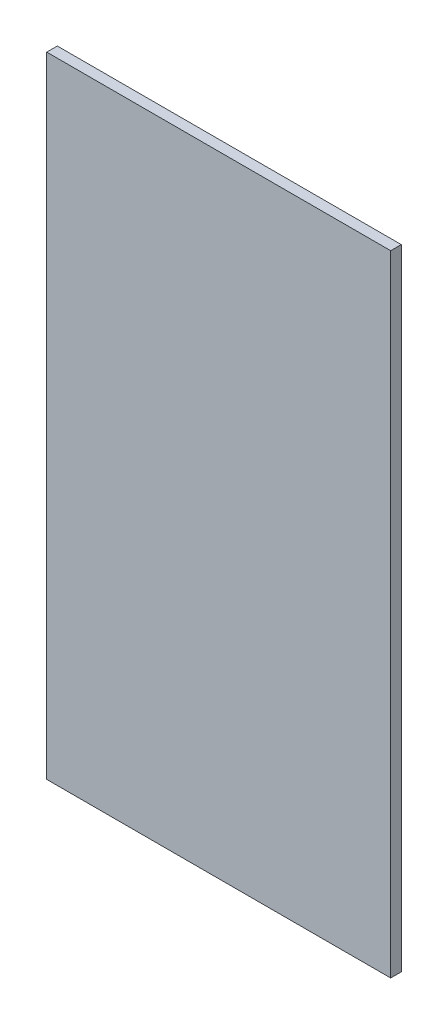
ISO-10303-21;
HEADER;
FILE_DESCRIPTION(('STEP AP214'),'2;1');
FILE_NAME('part.step','',(''),(''),'','','');
FILE_SCHEMA(('AUTOMOTIVE_DESIGN { 1 0 10303 214 1 1 1 1 }'));
ENDSEC;
DATA;
#1=APPLICATION_CONTEXT('core data for automotive mechanical design processes');
#2=APPLICATION_PROTOCOL_DEFINITION('international standard','automotive_design',2000,#1);
#3=PRODUCT_CONTEXT('',#1,'mechanical');
#4=PRODUCT('Part','Part','',(#3));
#5=PRODUCT_RELATED_PRODUCT_CATEGORY('part','',(#4));
#6=PRODUCT_DEFINITION_FORMATION('','',#4);
#7=PRODUCT_DEFINITION_CONTEXT('part definition',#1,'design');
#8=PRODUCT_DEFINITION('design','',#6,#7);
#9=PRODUCT_DEFINITION_SHAPE('','',#8);
#10=(LENGTH_UNIT() NAMED_UNIT(*) SI_UNIT(.MILLI.,.METRE.));
#11=(NAMED_UNIT(*) PLANE_ANGLE_UNIT() SI_UNIT($,.RADIAN.));
#12=(NAMED_UNIT(*) SI_UNIT($,.STERADIAN.) SOLID_ANGLE_UNIT());
#13=UNCERTAINTY_MEASURE_WITH_UNIT(LENGTH_MEASURE(1.E-05),#10,'distance_accuracy_value','');
#14=(GEOMETRIC_REPRESENTATION_CONTEXT(3) GLOBAL_UNCERTAINTY_ASSIGNED_CONTEXT((#13)) GLOBAL_UNIT_ASSIGNED_CONTEXT((#10,
#11,#12)) REPRESENTATION_CONTEXT('',''));
#15=CARTESIAN_POINT('',(0.,0.,0.));
#16=DIRECTION('',(0.,0.,1.));
#17=DIRECTION('',(1.,0.,0.));
#18=AXIS2_PLACEMENT_3D('',#15,#16,#17);
#19=CARTESIAN_POINT('',(-82.1417564719106,-79.8315195711381,5.));
#20=DIRECTION('',(0.,1.,0.));
#21=DIRECTION('',(0.,0.,1.));
#22=AXIS2_PLACEMENT_3D('',#19,#20,#21);
#23=PLANE('',#22);
#24=DIRECTION('',(1.,0.,0.));
#25=VECTOR('',#24,1.);
#26=CARTESIAN_POINT('',(-82.1417564719106,-79.8315195711381,0.));
#27=LINE('',#26,#25);
#28=CARTESIAN_POINT('',(-82.1417564719106,-79.8315195711381,0.));
#29=VERTEX_POINT('',#28);
#30=CARTESIAN_POINT('',(80.3582435280894,-79.8315195711381,0.));
#31=VERTEX_POINT('',#30);
#32=EDGE_CURVE('E98',#29,#31,#27,.T.);
#33=ORIENTED_EDGE('',*,*,#32,.T.);
#34=DIRECTION('',(0.,0.,-1.));
#35=VECTOR('',#34,1.);
#36=CARTESIAN_POINT('',(80.3582435280894,-79.8315195711381,5.));
#37=LINE('',#36,#35);
#38=CARTESIAN_POINT('',(80.3582435280894,-79.8315195711381,5.));
#39=VERTEX_POINT('',#38);
#40=EDGE_CURVE('E11',#39,#31,#37,.T.);
#41=ORIENTED_EDGE('',*,*,#40,.F.);
#42=DIRECTION('',(1.,0.,0.));
#43=VECTOR('',#42,1.);
#44=CARTESIAN_POINT('',(-82.1417564719106,-79.8315195711381,5.));
#45=LINE('',#44,#43);
#46=CARTESIAN_POINT('',(-82.1417564719106,-79.8315195711381,5.));
#47=VERTEX_POINT('',#46);
#48=EDGE_CURVE('E75',#47,#39,#45,.T.);
#49=ORIENTED_EDGE('',*,*,#48,.F.);
#50=DIRECTION('',(0.,0.,-1.));
#51=VECTOR('',#50,1.);
#52=CARTESIAN_POINT('',(-82.1417564719106,-79.8315195711381,5.));
#53=LINE('',#52,#51);
#54=EDGE_CURVE('E94',#47,#29,#53,.T.);
#55=ORIENTED_EDGE('',*,*,#54,.T.);
#56=EDGE_LOOP('',(#33,#41,#49,#55));
#57=FACE_BOUND('',#56,.T.);
#58=ADVANCED_FACE('F36',(#57),#23,.F.);
#59=CARTESIAN_POINT('',(80.3582435280894,217.768480428862,5.));
#60=DIRECTION('',(1.,0.,0.));
#61=DIRECTION('',(0.,1.,0.));
#62=AXIS2_PLACEMENT_3D('',#59,#60,#61);
#63=PLANE('',#62);
#64=DIRECTION('',(0.,-1.,0.));
#65=VECTOR('',#64,1.);
#66=CARTESIAN_POINT('',(80.3582435280894,217.768480428862,0.));
#67=LINE('',#66,#65);
#68=CARTESIAN_POINT('',(80.3582435280894,217.768480428862,0.));
#69=VERTEX_POINT('',#68);
#70=EDGE_CURVE('E84',#69,#31,#67,.T.);
#71=ORIENTED_EDGE('',*,*,#70,.F.);
#72=DIRECTION('',(0.,0.,-1.));
#73=VECTOR('',#72,1.);
#74=CARTESIAN_POINT('',(80.3582435280894,217.768480428862,5.));
#75=LINE('',#74,#73);
#76=CARTESIAN_POINT('',(80.3582435280894,217.768480428862,5.));
#77=VERTEX_POINT('',#76);
#78=EDGE_CURVE('E44',#77,#69,#75,.T.);
#79=ORIENTED_EDGE('',*,*,#78,.F.);
#80=DIRECTION('',(0.,-1.,0.));
#81=VECTOR('',#80,1.);
#82=CARTESIAN_POINT('',(80.3582435280894,217.768480428862,5.));
#83=LINE('',#82,#81);
#84=EDGE_CURVE('E82',#77,#39,#83,.T.);
#85=ORIENTED_EDGE('',*,*,#84,.T.);
#86=ORIENTED_EDGE('',*,*,#40,.T.);
#87=EDGE_LOOP('',(#71,#79,#85,#86));
#88=FACE_BOUND('',#87,.T.);
#89=ADVANCED_FACE('F81',(#88),#63,.T.);
#90=CARTESIAN_POINT('',(-82.1417564719106,217.768480428862,5.));
#91=DIRECTION('',(0.,1.,0.));
#92=DIRECTION('',(0.,0.,1.));
#93=AXIS2_PLACEMENT_3D('',#90,#91,#92);
#94=PLANE('',#93);
#95=DIRECTION('',(1.,0.,0.));
#96=VECTOR('',#95,1.);
#97=CARTESIAN_POINT('',(-82.1417564719106,217.768480428862,0.));
#98=LINE('',#97,#96);
#99=CARTESIAN_POINT('',(-82.1417564719106,217.768480428862,0.));
#100=VERTEX_POINT('',#99);
#101=EDGE_CURVE('E102',#100,#69,#98,.T.);
#102=ORIENTED_EDGE('',*,*,#101,.F.);
#103=DIRECTION('',(0.,0.,-1.));
#104=VECTOR('',#103,1.);
#105=CARTESIAN_POINT('',(-82.1417564719106,217.768480428862,5.));
#106=LINE('',#105,#104);
#107=CARTESIAN_POINT('',(-82.1417564719106,217.768480428862,5.));
#108=VERTEX_POINT('',#107);
#109=EDGE_CURVE('E67',#108,#100,#106,.T.);
#110=ORIENTED_EDGE('',*,*,#109,.F.);
#111=DIRECTION('',(1.,0.,0.));
#112=VECTOR('',#111,1.);
#113=CARTESIAN_POINT('',(-82.1417564719106,217.768480428862,5.));
#114=LINE('',#113,#112);
#115=EDGE_CURVE('E90',#108,#77,#114,.T.);
#116=ORIENTED_EDGE('',*,*,#115,.T.);
#117=ORIENTED_EDGE('',*,*,#78,.T.);
#118=EDGE_LOOP('',(#102,#110,#116,#117));
#119=FACE_BOUND('',#118,.T.);
#120=ADVANCED_FACE('F92',(#119),#94,.T.);
#121=CARTESIAN_POINT('',(-82.1417564719106,217.768480428862,5.));
#122=DIRECTION('',(1.,0.,0.));
#123=DIRECTION('',(0.,1.,0.));
#124=AXIS2_PLACEMENT_3D('',#121,#122,#123);
#125=PLANE('',#124);
#126=DIRECTION('',(0.,-1.,0.));
#127=VECTOR('',#126,1.);
#128=CARTESIAN_POINT('',(-82.1417564719106,217.768480428862,0.));
#129=LINE('',#128,#127);
#130=EDGE_CURVE('E70',#100,#29,#129,.T.);
#131=ORIENTED_EDGE('',*,*,#130,.T.);
#132=ORIENTED_EDGE('',*,*,#54,.F.);
#133=DIRECTION('',(0.,-1.,0.));
#134=VECTOR('',#133,1.);
#135=CARTESIAN_POINT('',(-82.1417564719106,217.768480428862,5.));
#136=LINE('',#135,#134);
#137=EDGE_CURVE('E52',#108,#47,#136,.T.);
#138=ORIENTED_EDGE('',*,*,#137,.F.);
#139=ORIENTED_EDGE('',*,*,#109,.T.);
#140=EDGE_LOOP('',(#131,#132,#138,#139));
#141=FACE_BOUND('',#140,.T.);
#142=ADVANCED_FACE('F115',(#141),#125,.F.);
#143=CARTESIAN_POINT('',(0.,0.,5.));
#144=DIRECTION('',(0.,0.,-1.));
#145=DIRECTION('',(-1.,0.,0.));
#146=AXIS2_PLACEMENT_3D('',#143,#144,#145);
#147=PLANE('',#146);
#148=ORIENTED_EDGE('',*,*,#48,.T.);
#149=ORIENTED_EDGE('',*,*,#84,.F.);
#150=ORIENTED_EDGE('',*,*,#115,.F.);
#151=ORIENTED_EDGE('',*,*,#137,.T.);
#152=EDGE_LOOP('',(#148,#149,#150,#151));
#153=FACE_BOUND('',#152,.T.);
#154=ADVANCED_FACE('F89',(#153),#147,.F.);
#155=CARTESIAN_POINT('',(0.,0.,0.));
#156=DIRECTION('',(0.,0.,-1.));
#157=DIRECTION('',(-1.,0.,0.));
#158=AXIS2_PLACEMENT_3D('',#155,#156,#157);
#159=PLANE('',#158);
#160=ORIENTED_EDGE('',*,*,#32,.F.);
#161=ORIENTED_EDGE('',*,*,#130,.F.);
#162=ORIENTED_EDGE('',*,*,#101,.T.);
#163=ORIENTED_EDGE('',*,*,#70,.T.);
#164=EDGE_LOOP('',(#160,#161,#162,#163));
#165=FACE_BOUND('',#164,.T.);
#166=ADVANCED_FACE('F109',(#165),#159,.T.);
#167=CLOSED_SHELL('',(#58,#89,#120,#142,#154,#166));
#168=MANIFOLD_SOLID_BREP('B2',#167);
#169=ADVANCED_BREP_SHAPE_REPRESENTATION('',(#18,#168),#14);
#170=SHAPE_DEFINITION_REPRESENTATION(#9,#169);
ENDSEC;
END-ISO-10303-21;
